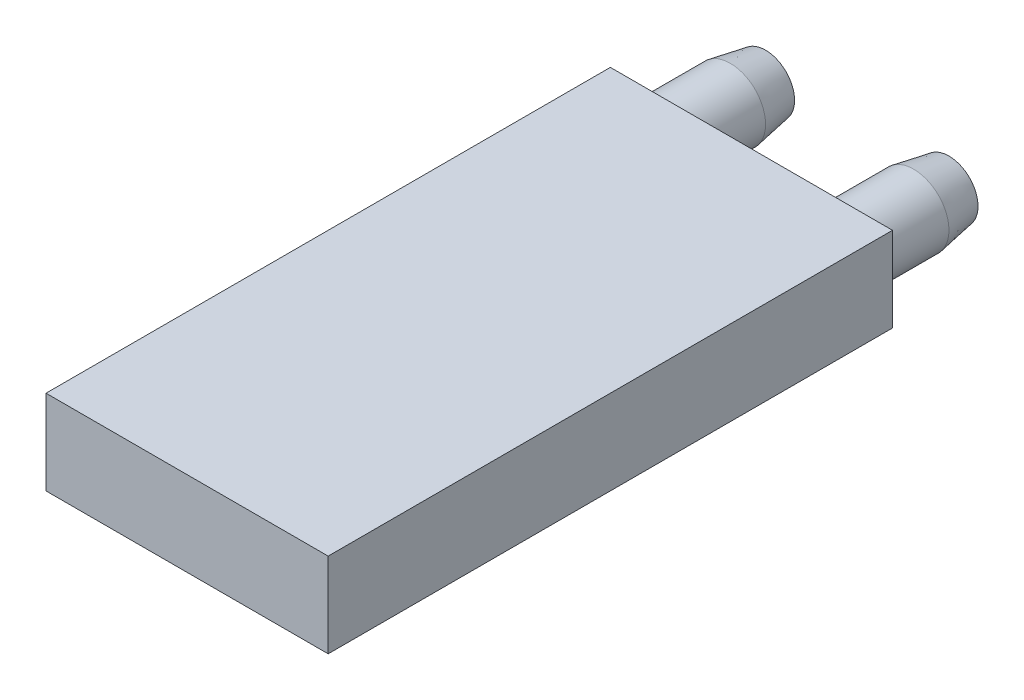
ISO-10303-21;
HEADER;
FILE_DESCRIPTION(('STEP AP214'),'2;1');
FILE_NAME('part.step','',(''),(''),'','','');
FILE_SCHEMA(('AUTOMOTIVE_DESIGN { 1 0 10303 214 1 1 1 1 }'));
ENDSEC;
DATA;
#1=APPLICATION_CONTEXT('core data for automotive mechanical design processes');
#2=APPLICATION_PROTOCOL_DEFINITION('international standard','automotive_design',2000,#1);
#3=PRODUCT_CONTEXT('',#1,'mechanical');
#4=PRODUCT('Part','Part','',(#3));
#5=PRODUCT_RELATED_PRODUCT_CATEGORY('part','',(#4));
#6=PRODUCT_DEFINITION_FORMATION('','',#4);
#7=PRODUCT_DEFINITION_CONTEXT('part definition',#1,'design');
#8=PRODUCT_DEFINITION('design','',#6,#7);
#9=PRODUCT_DEFINITION_SHAPE('','',#8);
#10=(LENGTH_UNIT() NAMED_UNIT(*) SI_UNIT(.MILLI.,.METRE.));
#11=(NAMED_UNIT(*) PLANE_ANGLE_UNIT() SI_UNIT($,.RADIAN.));
#12=(NAMED_UNIT(*) SI_UNIT($,.STERADIAN.) SOLID_ANGLE_UNIT());
#13=UNCERTAINTY_MEASURE_WITH_UNIT(LENGTH_MEASURE(1.E-05),#10,'distance_accuracy_value','');
#14=(GEOMETRIC_REPRESENTATION_CONTEXT(3) GLOBAL_UNCERTAINTY_ASSIGNED_CONTEXT((#13)) GLOBAL_UNIT_ASSIGNED_CONTEXT((#10,
#11,#12)) REPRESENTATION_CONTEXT('',''));
#15=CARTESIAN_POINT('',(0.,0.,0.));
#16=DIRECTION('',(0.,0.,1.));
#17=DIRECTION('',(1.,0.,0.));
#18=AXIS2_PLACEMENT_3D('',#15,#16,#17);
#19=CARTESIAN_POINT('',(20.,6.,-40.));
#20=DIRECTION('',(-1.,0.,0.));
#21=DIRECTION('',(0.,0.,1.));
#22=AXIS2_PLACEMENT_3D('',#19,#20,#21);
#23=PLANE('',#22);
#24=DIRECTION('',(0.,0.,-1.));
#25=VECTOR('',#24,1.);
#26=CARTESIAN_POINT('',(20.,-6.,-40.));
#27=LINE('',#26,#25);
#28=CARTESIAN_POINT('',(20.,-6.,40.));
#29=VERTEX_POINT('',#28);
#30=CARTESIAN_POINT('',(20.,-6.,-40.));
#31=VERTEX_POINT('',#30);
#32=EDGE_CURVE('E115',#29,#31,#27,.T.);
#33=ORIENTED_EDGE('',*,*,#32,.T.);
#34=DIRECTION('',(0.,-1.,0.));
#35=VECTOR('',#34,1.);
#36=CARTESIAN_POINT('',(20.,6.,-40.));
#37=LINE('',#36,#35);
#38=CARTESIAN_POINT('',(20.,6.,-40.));
#39=VERTEX_POINT('',#38);
#40=EDGE_CURVE('E104',#39,#31,#37,.T.);
#41=ORIENTED_EDGE('',*,*,#40,.F.);
#42=DIRECTION('',(0.,0.,-1.));
#43=VECTOR('',#42,1.);
#44=CARTESIAN_POINT('',(20.,6.,-40.));
#45=LINE('',#44,#43);
#46=CARTESIAN_POINT('',(20.,6.,40.));
#47=VERTEX_POINT('',#46);
#48=EDGE_CURVE('E96',#47,#39,#45,.T.);
#49=ORIENTED_EDGE('',*,*,#48,.F.);
#50=DIRECTION('',(0.,-1.,0.));
#51=VECTOR('',#50,1.);
#52=CARTESIAN_POINT('',(20.,6.,40.));
#53=LINE('',#52,#51);
#54=EDGE_CURVE('E111',#47,#29,#53,.T.);
#55=ORIENTED_EDGE('',*,*,#54,.T.);
#56=EDGE_LOOP('',(#33,#41,#49,#55));
#57=FACE_BOUND('',#56,.T.);
#58=ADVANCED_FACE('F41',(#57),#23,.F.);
#59=CARTESIAN_POINT('',(-20.,6.,-40.));
#60=DIRECTION('',(0.,0.,1.));
#61=DIRECTION('',(1.,0.,0.));
#62=AXIS2_PLACEMENT_3D('',#59,#60,#61);
#63=PLANE('',#62);
#64=CARTESIAN_POINT('',(13.,0.,-40.));
#65=DIRECTION('',(0.,0.,1.));
#66=DIRECTION('',(1.,0.,0.));
#67=AXIS2_PLACEMENT_3D('',#64,#65,#66);
#68=CIRCLE('',#67,5.);
#69=CARTESIAN_POINT('',(18.,0.,-40.));
#70=VERTEX_POINT('',#69);
#71=EDGE_CURVE('E135',#70,#70,#68,.F.);
#72=ORIENTED_EDGE('',*,*,#71,.F.);
#73=EDGE_LOOP('',(#72));
#74=FACE_BOUND('',#73,.T.);
#75=CARTESIAN_POINT('',(-13.,0.,-40.));
#76=DIRECTION('',(0.,0.,1.));
#77=DIRECTION('',(1.,0.,0.));
#78=AXIS2_PLACEMENT_3D('',#75,#76,#77);
#79=CIRCLE('',#78,5.);
#80=CARTESIAN_POINT('',(-8.,0.,-40.));
#81=VERTEX_POINT('',#80);
#82=EDGE_CURVE('E131',#81,#81,#79,.F.);
#83=ORIENTED_EDGE('',*,*,#82,.F.);
#84=EDGE_LOOP('',(#83));
#85=FACE_BOUND('',#84,.T.);
#86=DIRECTION('',(-1.,0.,0.));
#87=VECTOR('',#86,1.);
#88=CARTESIAN_POINT('',(-20.,-6.,-40.));
#89=LINE('',#88,#87);
#90=CARTESIAN_POINT('',(-20.,-6.,-40.));
#91=VERTEX_POINT('',#90);
#92=EDGE_CURVE('E102',#31,#91,#89,.T.);
#93=ORIENTED_EDGE('',*,*,#92,.T.);
#94=DIRECTION('',(0.,-1.,0.));
#95=VECTOR('',#94,1.);
#96=CARTESIAN_POINT('',(-20.,6.,-40.));
#97=LINE('',#96,#95);
#98=CARTESIAN_POINT('',(-20.,6.,-40.));
#99=VERTEX_POINT('',#98);
#100=EDGE_CURVE('E100',#99,#91,#97,.T.);
#101=ORIENTED_EDGE('',*,*,#100,.F.);
#102=DIRECTION('',(-1.,0.,0.));
#103=VECTOR('',#102,1.);
#104=CARTESIAN_POINT('',(-20.,6.,-40.));
#105=LINE('',#104,#103);
#106=EDGE_CURVE('E91',#39,#99,#105,.T.);
#107=ORIENTED_EDGE('',*,*,#106,.F.);
#108=ORIENTED_EDGE('',*,*,#40,.T.);
#109=EDGE_LOOP('',(#93,#101,#107,#108));
#110=FACE_BOUND('',#109,.T.);
#111=ADVANCED_FACE('F101',(#74,#85,#110),#63,.F.);
#112=CARTESIAN_POINT('',(-20.,6.,-40.));
#113=DIRECTION('',(1.,0.,0.));
#114=DIRECTION('',(0.,0.,-1.));
#115=AXIS2_PLACEMENT_3D('',#112,#113,#114);
#116=PLANE('',#115);
#117=DIRECTION('',(0.,0.,1.));
#118=VECTOR('',#117,1.);
#119=CARTESIAN_POINT('',(-20.,-6.,-40.));
#120=LINE('',#119,#118);
#121=CARTESIAN_POINT('',(-20.,-6.,40.));
#122=VERTEX_POINT('',#121);
#123=EDGE_CURVE('E77',#91,#122,#120,.T.);
#124=ORIENTED_EDGE('',*,*,#123,.T.);
#125=DIRECTION('',(0.,-1.,0.));
#126=VECTOR('',#125,1.);
#127=CARTESIAN_POINT('',(-20.,6.,40.));
#128=LINE('',#127,#126);
#129=CARTESIAN_POINT('',(-20.,6.,40.));
#130=VERTEX_POINT('',#129);
#131=EDGE_CURVE('E105',#130,#122,#128,.T.);
#132=ORIENTED_EDGE('',*,*,#131,.F.);
#133=DIRECTION('',(0.,0.,1.));
#134=VECTOR('',#133,1.);
#135=CARTESIAN_POINT('',(-20.,6.,-40.));
#136=LINE('',#135,#134);
#137=EDGE_CURVE('E94',#99,#130,#136,.T.);
#138=ORIENTED_EDGE('',*,*,#137,.F.);
#139=ORIENTED_EDGE('',*,*,#100,.T.);
#140=EDGE_LOOP('',(#124,#132,#138,#139));
#141=FACE_BOUND('',#140,.T.);
#142=ADVANCED_FACE('F107',(#141),#116,.F.);
#143=CARTESIAN_POINT('',(-20.,6.,40.));
#144=DIRECTION('',(0.,0.,-1.));
#145=DIRECTION('',(-1.,0.,0.));
#146=AXIS2_PLACEMENT_3D('',#143,#144,#145);
#147=PLANE('',#146);
#148=DIRECTION('',(1.,0.,0.));
#149=VECTOR('',#148,1.);
#150=CARTESIAN_POINT('',(-20.,-6.,40.));
#151=LINE('',#150,#149);
#152=EDGE_CURVE('E83',#122,#29,#151,.T.);
#153=ORIENTED_EDGE('',*,*,#152,.T.);
#154=ORIENTED_EDGE('',*,*,#54,.F.);
#155=DIRECTION('',(1.,0.,0.));
#156=VECTOR('',#155,1.);
#157=CARTESIAN_POINT('',(-20.,6.,40.));
#158=LINE('',#157,#156);
#159=EDGE_CURVE('E60',#130,#47,#158,.T.);
#160=ORIENTED_EDGE('',*,*,#159,.F.);
#161=ORIENTED_EDGE('',*,*,#131,.T.);
#162=EDGE_LOOP('',(#153,#154,#160,#161));
#163=FACE_BOUND('',#162,.T.);
#164=ADVANCED_FACE('F176',(#163),#147,.F.);
#165=CARTESIAN_POINT('',(0.,6.,0.));
#166=DIRECTION('',(0.,1.,0.));
#167=DIRECTION('',(0.,0.,1.));
#168=AXIS2_PLACEMENT_3D('',#165,#166,#167);
#169=PLANE('',#168);
#170=ORIENTED_EDGE('',*,*,#48,.T.);
#171=ORIENTED_EDGE('',*,*,#106,.T.);
#172=ORIENTED_EDGE('',*,*,#137,.T.);
#173=ORIENTED_EDGE('',*,*,#159,.T.);
#174=EDGE_LOOP('',(#170,#171,#172,#173));
#175=FACE_BOUND('',#174,.T.);
#176=ADVANCED_FACE('F92',(#175),#169,.T.);
#177=CARTESIAN_POINT('',(0.,-6.,0.));
#178=DIRECTION('',(0.,1.,0.));
#179=DIRECTION('',(0.,0.,1.));
#180=AXIS2_PLACEMENT_3D('',#177,#178,#179);
#181=PLANE('',#180);
#182=ORIENTED_EDGE('',*,*,#32,.F.);
#183=ORIENTED_EDGE('',*,*,#152,.F.);
#184=ORIENTED_EDGE('',*,*,#123,.F.);
#185=ORIENTED_EDGE('',*,*,#92,.F.);
#186=EDGE_LOOP('',(#182,#183,#184,#185));
#187=FACE_BOUND('',#186,.T.);
#188=ADVANCED_FACE('F179',(#187),#181,.F.);
#189=CARTESIAN_POINT('',(-13.,0.,-55.));
#190=DIRECTION('',(0.,0.,1.));
#191=DIRECTION('',(1.,0.,0.));
#192=AXIS2_PLACEMENT_3D('',#189,#190,#191);
#193=CYLINDRICAL_SURFACE('',#192,5.);
#194=CARTESIAN_POINT('',(-13.,0.,-49.9999999999997));
#195=DIRECTION('',(0.,0.,-1.));
#196=DIRECTION('',(-1.,0.,0.));
#197=AXIS2_PLACEMENT_3D('',#194,#195,#196);
#198=CIRCLE('',#197,5.);
#199=CARTESIAN_POINT('',(-18.,0.,-49.9999999999997));
#200=VERTEX_POINT('',#199);
#201=EDGE_CURVE('E143',#200,#200,#198,.F.);
#202=ORIENTED_EDGE('',*,*,#201,.T.);
#203=EDGE_LOOP('',(#202));
#204=FACE_BOUND('',#203,.T.);
#205=ORIENTED_EDGE('',*,*,#82,.T.);
#206=EDGE_LOOP('',(#205));
#207=FACE_BOUND('',#206,.T.);
#208=ADVANCED_FACE('F182',(#204,#207),#193,.T.);
#209=CARTESIAN_POINT('',(-13.,0.,-55.));
#210=DIRECTION('',(0.,0.,-1.));
#211=DIRECTION('',(-1.,0.,0.));
#212=AXIS2_PLACEMENT_3D('',#209,#210,#211);
#213=PLANE('',#212);
#214=CARTESIAN_POINT('',(-13.,0.,-55.));
#215=DIRECTION('',(0.,0.,-1.));
#216=DIRECTION('',(-1.,0.,0.));
#217=AXIS2_PLACEMENT_3D('',#214,#215,#216);
#218=CIRCLE('',#217,4.11836509645764);
#219=CARTESIAN_POINT('',(-17.1183650964576,0.,-55.));
#220=VERTEX_POINT('',#219);
#221=EDGE_CURVE('E139',#220,#220,#218,.T.);
#222=ORIENTED_EDGE('',*,*,#221,.T.);
#223=EDGE_LOOP('',(#222));
#224=FACE_BOUND('',#223,.T.);
#225=ADVANCED_FACE('F188',(#224),#213,.T.);
#226=CARTESIAN_POINT('',(13.,0.,-55.));
#227=DIRECTION('',(0.,0.,1.));
#228=DIRECTION('',(1.,0.,0.));
#229=AXIS2_PLACEMENT_3D('',#226,#227,#228);
#230=CYLINDRICAL_SURFACE('',#229,5.);
#231=CARTESIAN_POINT('',(13.,0.,-49.9999999999997));
#232=DIRECTION('',(0.,0.,1.));
#233=DIRECTION('',(1.,0.,0.));
#234=AXIS2_PLACEMENT_3D('',#231,#232,#233);
#235=CIRCLE('',#234,5.);
#236=CARTESIAN_POINT('',(18.,0.,-49.9999999999997));
#237=VERTEX_POINT('',#236);
#238=EDGE_CURVE('E11',#237,#237,#235,.T.);
#239=ORIENTED_EDGE('',*,*,#238,.T.);
#240=EDGE_LOOP('',(#239));
#241=FACE_BOUND('',#240,.T.);
#242=ORIENTED_EDGE('',*,*,#71,.T.);
#243=EDGE_LOOP('',(#242));
#244=FACE_BOUND('',#243,.T.);
#245=ADVANCED_FACE('F192',(#241,#244),#230,.T.);
#246=CARTESIAN_POINT('',(13.,0.,-55.));
#247=DIRECTION('',(0.,0.,1.));
#248=DIRECTION('',(1.,0.,0.));
#249=AXIS2_PLACEMENT_3D('',#246,#247,#248);
#250=PLANE('',#249);
#251=CARTESIAN_POINT('',(13.,0.,-55.));
#252=DIRECTION('',(0.,0.,1.));
#253=DIRECTION('',(1.,0.,0.));
#254=AXIS2_PLACEMENT_3D('',#251,#252,#253);
#255=CIRCLE('',#254,4.11836509645764);
#256=CARTESIAN_POINT('',(17.1183650964576,0.,-55.));
#257=VERTEX_POINT('',#256);
#258=EDGE_CURVE('E52',#257,#257,#255,.F.);
#259=ORIENTED_EDGE('',*,*,#258,.T.);
#260=EDGE_LOOP('',(#259));
#261=FACE_BOUND('',#260,.T.);
#262=ADVANCED_FACE('F150',(#261),#250,.F.);
#263=CARTESIAN_POINT('',(-13.,0.,-55.));
#264=DIRECTION('',(0.,0.,1.));
#265=DIRECTION('',(1.,0.,0.));
#266=AXIS2_PLACEMENT_3D('',#263,#264,#265);
#267=CONICAL_SURFACE('',#266,4.11836509645764,0.174532925199429);
#268=ORIENTED_EDGE('',*,*,#201,.F.);
#269=EDGE_LOOP('',(#268));
#270=FACE_BOUND('',#269,.T.);
#271=ORIENTED_EDGE('',*,*,#221,.F.);
#272=EDGE_LOOP('',(#271));
#273=FACE_BOUND('',#272,.T.);
#274=ADVANCED_FACE('F153',(#270,#273),#267,.T.);
#275=CARTESIAN_POINT('',(13.,0.,-55.));
#276=DIRECTION('',(0.,0.,1.));
#277=DIRECTION('',(1.,0.,0.));
#278=AXIS2_PLACEMENT_3D('',#275,#276,#277);
#279=CONICAL_SURFACE('',#278,4.11836509645764,0.174532925199429);
#280=ORIENTED_EDGE('',*,*,#238,.F.);
#281=EDGE_LOOP('',(#280));
#282=FACE_BOUND('',#281,.T.);
#283=ORIENTED_EDGE('',*,*,#258,.F.);
#284=EDGE_LOOP('',(#283));
#285=FACE_BOUND('',#284,.T.);
#286=ADVANCED_FACE('F44',(#282,#285),#279,.T.);
#287=CLOSED_SHELL('',(#58,#111,#142,#164,#176,#188,#208,#225,#245,#262,#274,#286));
#288=MANIFOLD_SOLID_BREP('B2',#287);
#289=ADVANCED_BREP_SHAPE_REPRESENTATION('',(#18,#288),#14);
#290=SHAPE_DEFINITION_REPRESENTATION(#9,#289);
ENDSEC;
END-ISO-10303-21;
